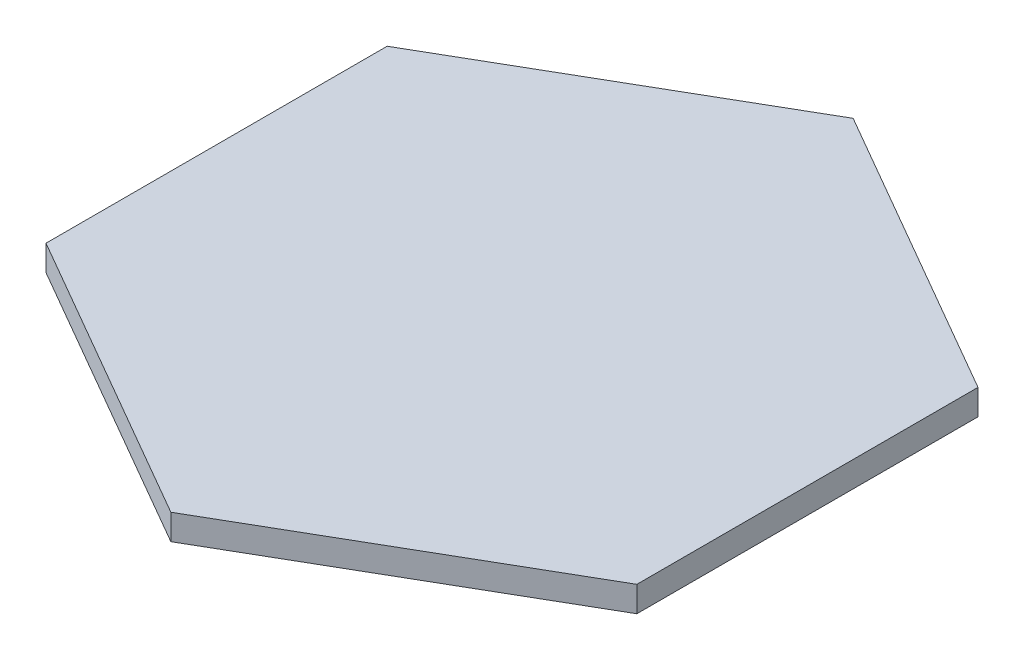
ISO-10303-21;
HEADER;
FILE_DESCRIPTION(('STEP AP214'),'2;1');
FILE_NAME('part.step','',(''),(''),'','','');
FILE_SCHEMA(('AUTOMOTIVE_DESIGN { 1 0 10303 214 1 1 1 1 }'));
ENDSEC;
DATA;
#1=APPLICATION_CONTEXT('core data for automotive mechanical design processes');
#2=APPLICATION_PROTOCOL_DEFINITION('international standard','automotive_design',2000,#1);
#3=PRODUCT_CONTEXT('',#1,'mechanical');
#4=PRODUCT('Part','Part','',(#3));
#5=PRODUCT_RELATED_PRODUCT_CATEGORY('part','',(#4));
#6=PRODUCT_DEFINITION_FORMATION('','',#4);
#7=PRODUCT_DEFINITION_CONTEXT('part definition',#1,'design');
#8=PRODUCT_DEFINITION('design','',#6,#7);
#9=PRODUCT_DEFINITION_SHAPE('','',#8);
#10=(LENGTH_UNIT() NAMED_UNIT(*) SI_UNIT(.MILLI.,.METRE.));
#11=(NAMED_UNIT(*) PLANE_ANGLE_UNIT() SI_UNIT($,.RADIAN.));
#12=(NAMED_UNIT(*) SI_UNIT($,.STERADIAN.) SOLID_ANGLE_UNIT());
#13=UNCERTAINTY_MEASURE_WITH_UNIT(LENGTH_MEASURE(1.E-05),#10,'distance_accuracy_value','');
#14=(GEOMETRIC_REPRESENTATION_CONTEXT(3) GLOBAL_UNCERTAINTY_ASSIGNED_CONTEXT((#13)) GLOBAL_UNIT_ASSIGNED_CONTEXT((#10,
#11,#12)) REPRESENTATION_CONTEXT('',''));
#15=CARTESIAN_POINT('',(0.,0.,0.));
#16=DIRECTION('',(0.,0.,1.));
#17=DIRECTION('',(1.,0.,0.));
#18=AXIS2_PLACEMENT_3D('',#15,#16,#17);
#19=CARTESIAN_POINT('',(440.,38.,-254.034118443435));
#20=DIRECTION('',(-0.5,0.,0.866025403784439));
#21=DIRECTION('',(0.866025403784439,0.,0.5));
#22=AXIS2_PLACEMENT_3D('',#19,#20,#21);
#23=PLANE('',#22);
#24=DIRECTION('',(-0.866025403784439,0.,-0.5));
#25=VECTOR('',#24,1.);
#26=CARTESIAN_POINT('',(440.,0.,-254.034118443435));
#27=LINE('',#26,#25);
#28=CARTESIAN_POINT('',(440.,0.,-254.034118443435));
#29=VERTEX_POINT('',#28);
#30=CARTESIAN_POINT('',(-1.93771354206743E-13,0.,-508.068236886871));
#31=VERTEX_POINT('',#30);
#32=EDGE_CURVE('E117',#29,#31,#27,.T.);
#33=ORIENTED_EDGE('',*,*,#32,.T.);
#34=DIRECTION('',(0.,-1.,0.));
#35=VECTOR('',#34,1.);
#36=CARTESIAN_POINT('',(-1.93771354206743E-13,38.,-508.068236886871));
#37=LINE('',#36,#35);
#38=CARTESIAN_POINT('',(-1.93771354206743E-13,38.,-508.068236886871));
#39=VERTEX_POINT('',#38);
#40=EDGE_CURVE('E11',#39,#31,#37,.T.);
#41=ORIENTED_EDGE('',*,*,#40,.F.);
#42=DIRECTION('',(-0.866025403784439,0.,-0.5));
#43=VECTOR('',#42,1.);
#44=CARTESIAN_POINT('',(440.,38.,-254.034118443435));
#45=LINE('',#44,#43);
#46=CARTESIAN_POINT('',(440.,38.,-254.034118443435));
#47=VERTEX_POINT('',#46);
#48=EDGE_CURVE('E127',#47,#39,#45,.T.);
#49=ORIENTED_EDGE('',*,*,#48,.F.);
#50=DIRECTION('',(0.,-1.,0.));
#51=VECTOR('',#50,1.);
#52=CARTESIAN_POINT('',(440.,38.,-254.034118443435));
#53=LINE('',#52,#51);
#54=EDGE_CURVE('E113',#47,#29,#53,.T.);
#55=ORIENTED_EDGE('',*,*,#54,.T.);
#56=EDGE_LOOP('',(#33,#41,#49,#55));
#57=FACE_BOUND('',#56,.T.);
#58=ADVANCED_FACE('F33',(#57),#23,.F.);
#59=CARTESIAN_POINT('',(-1.93771354206743E-13,38.,-508.068236886871));
#60=DIRECTION('',(0.5,0.,0.866025403784439));
#61=DIRECTION('',(0.866025403784439,0.,-0.5));
#62=AXIS2_PLACEMENT_3D('',#59,#60,#61);
#63=PLANE('',#62);
#64=DIRECTION('',(-0.866025403784438,0.,0.5));
#65=VECTOR('',#64,1.);
#66=CARTESIAN_POINT('',(-1.93771354206743E-13,0.,-508.068236886871));
#67=LINE('',#66,#65);
#68=CARTESIAN_POINT('',(-440.,0.,-254.034118443435));
#69=VERTEX_POINT('',#68);
#70=EDGE_CURVE('E120',#31,#69,#67,.T.);
#71=ORIENTED_EDGE('',*,*,#70,.T.);
#72=DIRECTION('',(0.,-1.,0.));
#73=VECTOR('',#72,1.);
#74=CARTESIAN_POINT('',(-440.,38.,-254.034118443435));
#75=LINE('',#74,#73);
#76=CARTESIAN_POINT('',(-440.,38.,-254.034118443435));
#77=VERTEX_POINT('',#76);
#78=EDGE_CURVE('E41',#77,#69,#75,.T.);
#79=ORIENTED_EDGE('',*,*,#78,.F.);
#80=DIRECTION('',(-0.866025403784438,0.,0.5));
#81=VECTOR('',#80,1.);
#82=CARTESIAN_POINT('',(-1.93771354206743E-13,38.,-508.068236886871));
#83=LINE('',#82,#81);
#84=EDGE_CURVE('E86',#39,#77,#83,.T.);
#85=ORIENTED_EDGE('',*,*,#84,.F.);
#86=ORIENTED_EDGE('',*,*,#40,.T.);
#87=EDGE_LOOP('',(#71,#79,#85,#86));
#88=FACE_BOUND('',#87,.T.);
#89=ADVANCED_FACE('F151',(#88),#63,.F.);
#90=CARTESIAN_POINT('',(-440.,38.,-254.034118443435));
#91=DIRECTION('',(1.,0.,0.));
#92=DIRECTION('',(0.,0.,-1.));
#93=AXIS2_PLACEMENT_3D('',#90,#91,#92);
#94=PLANE('',#93);
#95=DIRECTION('',(0.,0.,1.));
#96=VECTOR('',#95,1.);
#97=CARTESIAN_POINT('',(-440.,0.,-254.034118443435));
#98=LINE('',#97,#96);
#99=CARTESIAN_POINT('',(-440.,0.,254.034118443435));
#100=VERTEX_POINT('',#99);
#101=EDGE_CURVE('E122',#69,#100,#98,.T.);
#102=ORIENTED_EDGE('',*,*,#101,.T.);
#103=DIRECTION('',(0.,-1.,0.));
#104=VECTOR('',#103,1.);
#105=CARTESIAN_POINT('',(-440.,38.,254.034118443435));
#106=LINE('',#105,#104);
#107=CARTESIAN_POINT('',(-440.,38.,254.034118443435));
#108=VERTEX_POINT('',#107);
#109=EDGE_CURVE('E108',#108,#100,#106,.T.);
#110=ORIENTED_EDGE('',*,*,#109,.F.);
#111=DIRECTION('',(0.,0.,1.));
#112=VECTOR('',#111,1.);
#113=CARTESIAN_POINT('',(-440.,38.,-254.034118443435));
#114=LINE('',#113,#112);
#115=EDGE_CURVE('E99',#77,#108,#114,.T.);
#116=ORIENTED_EDGE('',*,*,#115,.F.);
#117=ORIENTED_EDGE('',*,*,#78,.T.);
#118=EDGE_LOOP('',(#102,#110,#116,#117));
#119=FACE_BOUND('',#118,.T.);
#120=ADVANCED_FACE('F133',(#119),#94,.F.);
#121=CARTESIAN_POINT('',(-440.,38.,254.034118443435));
#122=DIRECTION('',(0.5,0.,-0.866025403784439));
#123=DIRECTION('',(-0.866025403784439,0.,-0.5));
#124=AXIS2_PLACEMENT_3D('',#121,#122,#123);
#125=PLANE('',#124);
#126=DIRECTION('',(0.866025403784439,0.,0.5));
#127=VECTOR('',#126,1.);
#128=CARTESIAN_POINT('',(-440.,0.,254.034118443435));
#129=LINE('',#128,#127);
#130=CARTESIAN_POINT('',(1.01253379270198E-13,0.,508.068236886871));
#131=VERTEX_POINT('',#130);
#132=EDGE_CURVE('E107',#100,#131,#129,.T.);
#133=ORIENTED_EDGE('',*,*,#132,.T.);
#134=DIRECTION('',(0.,-1.,0.));
#135=VECTOR('',#134,1.);
#136=CARTESIAN_POINT('',(1.01253379270198E-13,38.,508.068236886871));
#137=LINE('',#136,#135);
#138=CARTESIAN_POINT('',(1.01253379270198E-13,38.,508.068236886871));
#139=VERTEX_POINT('',#138);
#140=EDGE_CURVE('E104',#139,#131,#137,.T.);
#141=ORIENTED_EDGE('',*,*,#140,.F.);
#142=DIRECTION('',(0.866025403784439,0.,0.5));
#143=VECTOR('',#142,1.);
#144=CARTESIAN_POINT('',(-440.,38.,254.034118443435));
#145=LINE('',#144,#143);
#146=EDGE_CURVE('E93',#108,#139,#145,.T.);
#147=ORIENTED_EDGE('',*,*,#146,.F.);
#148=ORIENTED_EDGE('',*,*,#109,.T.);
#149=EDGE_LOOP('',(#133,#141,#147,#148));
#150=FACE_BOUND('',#149,.T.);
#151=ADVANCED_FACE('F105',(#150),#125,.F.);
#152=CARTESIAN_POINT('',(1.01253379270198E-13,38.,508.068236886871));
#153=DIRECTION('',(-0.5,0.,-0.866025403784439));
#154=DIRECTION('',(-0.866025403784439,0.,0.5));
#155=AXIS2_PLACEMENT_3D('',#152,#153,#154);
#156=PLANE('',#155);
#157=DIRECTION('',(0.866025403784439,0.,-0.5));
#158=VECTOR('',#157,1.);
#159=CARTESIAN_POINT('',(1.01253379270198E-13,0.,508.068236886871));
#160=LINE('',#159,#158);
#161=CARTESIAN_POINT('',(440.,0.,254.034118443435));
#162=VERTEX_POINT('',#161);
#163=EDGE_CURVE('E72',#131,#162,#160,.T.);
#164=ORIENTED_EDGE('',*,*,#163,.T.);
#165=DIRECTION('',(0.,-1.,0.));
#166=VECTOR('',#165,1.);
#167=CARTESIAN_POINT('',(440.,38.,254.034118443435));
#168=LINE('',#167,#166);
#169=CARTESIAN_POINT('',(440.,38.,254.034118443435));
#170=VERTEX_POINT('',#169);
#171=EDGE_CURVE('E109',#170,#162,#168,.T.);
#172=ORIENTED_EDGE('',*,*,#171,.F.);
#173=DIRECTION('',(0.866025403784439,0.,-0.5));
#174=VECTOR('',#173,1.);
#175=CARTESIAN_POINT('',(1.01253379270198E-13,38.,508.068236886871));
#176=LINE('',#175,#174);
#177=EDGE_CURVE('E97',#139,#170,#176,.T.);
#178=ORIENTED_EDGE('',*,*,#177,.F.);
#179=ORIENTED_EDGE('',*,*,#140,.T.);
#180=EDGE_LOOP('',(#164,#172,#178,#179));
#181=FACE_BOUND('',#180,.T.);
#182=ADVANCED_FACE('F111',(#181),#156,.F.);
#183=CARTESIAN_POINT('',(440.,38.,254.034118443435));
#184=DIRECTION('',(-1.,0.,0.));
#185=DIRECTION('',(0.,0.,1.));
#186=AXIS2_PLACEMENT_3D('',#183,#184,#185);
#187=PLANE('',#186);
#188=DIRECTION('',(0.,0.,-1.));
#189=VECTOR('',#188,1.);
#190=CARTESIAN_POINT('',(440.,0.,254.034118443435));
#191=LINE('',#190,#189);
#192=EDGE_CURVE('E78',#162,#29,#191,.T.);
#193=ORIENTED_EDGE('',*,*,#192,.T.);
#194=ORIENTED_EDGE('',*,*,#54,.F.);
#195=DIRECTION('',(0.,0.,-1.));
#196=VECTOR('',#195,1.);
#197=CARTESIAN_POINT('',(440.,38.,254.034118443435));
#198=LINE('',#197,#196);
#199=EDGE_CURVE('E49',#170,#47,#198,.T.);
#200=ORIENTED_EDGE('',*,*,#199,.F.);
#201=ORIENTED_EDGE('',*,*,#171,.T.);
#202=EDGE_LOOP('',(#193,#194,#200,#201));
#203=FACE_BOUND('',#202,.T.);
#204=ADVANCED_FACE('F140',(#203),#187,.F.);
#205=CARTESIAN_POINT('',(0.,38.,0.));
#206=DIRECTION('',(0.,1.,0.));
#207=DIRECTION('',(0.,0.,1.));
#208=AXIS2_PLACEMENT_3D('',#205,#206,#207);
#209=PLANE('',#208);
#210=ORIENTED_EDGE('',*,*,#48,.T.);
#211=ORIENTED_EDGE('',*,*,#84,.T.);
#212=ORIENTED_EDGE('',*,*,#115,.T.);
#213=ORIENTED_EDGE('',*,*,#146,.T.);
#214=ORIENTED_EDGE('',*,*,#177,.T.);
#215=ORIENTED_EDGE('',*,*,#199,.T.);
#216=EDGE_LOOP('',(#210,#211,#212,#213,#214,#215));
#217=FACE_BOUND('',#216,.T.);
#218=ADVANCED_FACE('F95',(#217),#209,.T.);
#219=CARTESIAN_POINT('',(0.,0.,0.));
#220=DIRECTION('',(0.,1.,0.));
#221=DIRECTION('',(0.,0.,1.));
#222=AXIS2_PLACEMENT_3D('',#219,#220,#221);
#223=PLANE('',#222);
#224=ORIENTED_EDGE('',*,*,#32,.F.);
#225=ORIENTED_EDGE('',*,*,#192,.F.);
#226=ORIENTED_EDGE('',*,*,#163,.F.);
#227=ORIENTED_EDGE('',*,*,#132,.F.);
#228=ORIENTED_EDGE('',*,*,#101,.F.);
#229=ORIENTED_EDGE('',*,*,#70,.F.);
#230=EDGE_LOOP('',(#224,#225,#226,#227,#228,#229));
#231=FACE_BOUND('',#230,.T.);
#232=ADVANCED_FACE('F136',(#231),#223,.F.);
#233=CLOSED_SHELL('',(#58,#89,#120,#151,#182,#204,#218,#232));
#234=MANIFOLD_SOLID_BREP('B2',#233);
#235=ADVANCED_BREP_SHAPE_REPRESENTATION('',(#18,#234),#14);
#236=SHAPE_DEFINITION_REPRESENTATION(#9,#235);
ENDSEC;
END-ISO-10303-21;
